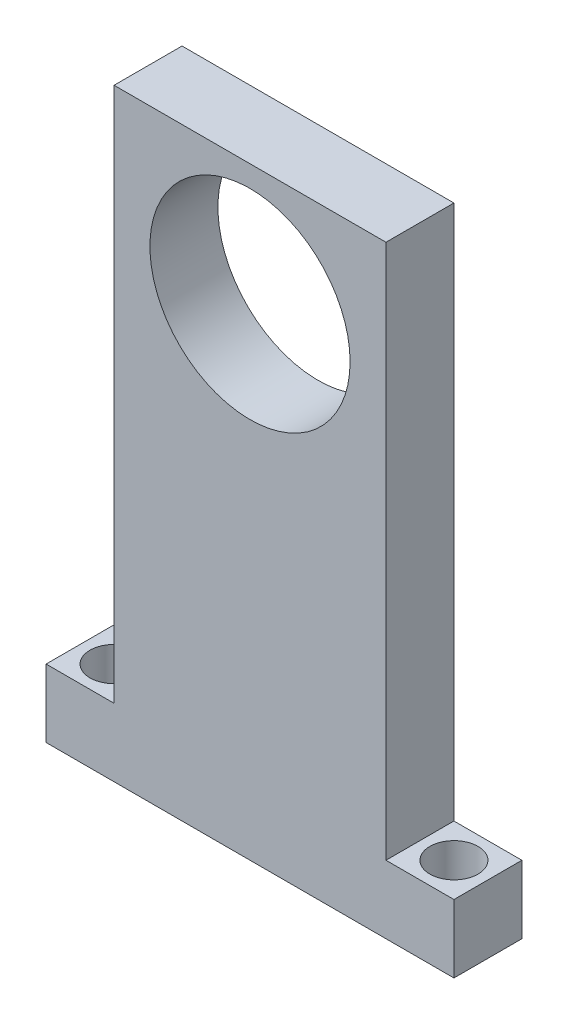
ISO-10303-21;
HEADER;
FILE_DESCRIPTION(('STEP AP214'),'2;1');
FILE_NAME('part.step','',(''),(''),'','','');
FILE_SCHEMA(('AUTOMOTIVE_DESIGN { 1 0 10303 214 1 1 1 1 }'));
ENDSEC;
DATA;
#1=APPLICATION_CONTEXT('core data for automotive mechanical design processes');
#2=APPLICATION_PROTOCOL_DEFINITION('international standard','automotive_design',2000,#1);
#3=PRODUCT_CONTEXT('',#1,'mechanical');
#4=PRODUCT('Part','Part','',(#3));
#5=PRODUCT_RELATED_PRODUCT_CATEGORY('part','',(#4));
#6=PRODUCT_DEFINITION_FORMATION('','',#4);
#7=PRODUCT_DEFINITION_CONTEXT('part definition',#1,'design');
#8=PRODUCT_DEFINITION('design','',#6,#7);
#9=PRODUCT_DEFINITION_SHAPE('','',#8);
#10=(LENGTH_UNIT() NAMED_UNIT(*) SI_UNIT(.MILLI.,.METRE.));
#11=(NAMED_UNIT(*) PLANE_ANGLE_UNIT() SI_UNIT($,.RADIAN.));
#12=(NAMED_UNIT(*) SI_UNIT($,.STERADIAN.) SOLID_ANGLE_UNIT());
#13=UNCERTAINTY_MEASURE_WITH_UNIT(LENGTH_MEASURE(1.E-05),#10,'distance_accuracy_value','');
#14=(GEOMETRIC_REPRESENTATION_CONTEXT(3) GLOBAL_UNCERTAINTY_ASSIGNED_CONTEXT((#13)) GLOBAL_UNIT_ASSIGNED_CONTEXT((#10,
#11,#12)) REPRESENTATION_CONTEXT('',''));
#15=CARTESIAN_POINT('',(0.,0.,0.));
#16=DIRECTION('',(0.,0.,1.));
#17=DIRECTION('',(1.,0.,0.));
#18=AXIS2_PLACEMENT_3D('',#15,#16,#17);
#19=CARTESIAN_POINT('',(0.,6.35,0.));
#20=DIRECTION('',(0.,-1.,0.));
#21=DIRECTION('',(0.,0.,-1.));
#22=AXIS2_PLACEMENT_3D('',#19,#20,#21);
#23=PLANE('',#22);
#24=CARTESIAN_POINT('',(15.875,6.35,0.));
#25=DIRECTION('',(0.,1.,0.));
#26=DIRECTION('',(0.,0.,1.));
#27=AXIS2_PLACEMENT_3D('',#24,#25,#26);
#28=CIRCLE('',#27,2.2479);
#29=CARTESIAN_POINT('',(15.875,6.35,2.2479));
#30=VERTEX_POINT('',#29);
#31=EDGE_CURVE('E191',#30,#30,#28,.T.);
#32=ORIENTED_EDGE('',*,*,#31,.F.);
#33=EDGE_LOOP('',(#32));
#34=FACE_BOUND('',#33,.T.);
#35=DIRECTION('',(0.,0.,-1.));
#36=VECTOR('',#35,1.);
#37=CARTESIAN_POINT('',(12.7,6.35,3.175));
#38=LINE('',#37,#36);
#39=CARTESIAN_POINT('',(12.7,6.35,3.175));
#40=VERTEX_POINT('',#39);
#41=CARTESIAN_POINT('',(12.7,6.35,-3.175));
#42=VERTEX_POINT('',#41);
#43=EDGE_CURVE('E54',#40,#42,#38,.T.);
#44=ORIENTED_EDGE('',*,*,#43,.F.);
#45=DIRECTION('',(1.,0.,0.));
#46=VECTOR('',#45,1.);
#47=CARTESIAN_POINT('',(-19.05,6.35,3.175));
#48=LINE('',#47,#46);
#49=CARTESIAN_POINT('',(19.05,6.35,3.175));
#50=VERTEX_POINT('',#49);
#51=EDGE_CURVE('E143',#40,#50,#48,.T.);
#52=ORIENTED_EDGE('',*,*,#51,.T.);
#53=DIRECTION('',(0.,0.,-1.));
#54=VECTOR('',#53,1.);
#55=CARTESIAN_POINT('',(19.05,6.35,3.175));
#56=LINE('',#55,#54);
#57=CARTESIAN_POINT('',(19.05,6.35,-3.175));
#58=VERTEX_POINT('',#57);
#59=EDGE_CURVE('E134',#50,#58,#56,.T.);
#60=ORIENTED_EDGE('',*,*,#59,.T.);
#61=DIRECTION('',(-1.,0.,0.));
#62=VECTOR('',#61,1.);
#63=CARTESIAN_POINT('',(-19.05,6.35,-3.175));
#64=LINE('',#63,#62);
#65=EDGE_CURVE('E139',#58,#42,#64,.T.);
#66=ORIENTED_EDGE('',*,*,#65,.T.);
#67=EDGE_LOOP('',(#44,#52,#60,#66));
#68=FACE_BOUND('',#67,.T.);
#69=ADVANCED_FACE('F39',(#34,#68),#23,.F.);
#70=CARTESIAN_POINT('',(-15.875,6.35,0.));
#71=DIRECTION('',(0.,1.,0.));
#72=DIRECTION('',(0.,0.,1.));
#73=AXIS2_PLACEMENT_3D('',#70,#71,#72);
#74=CIRCLE('',#73,2.2479);
#75=CARTESIAN_POINT('',(-15.875,6.35,2.2479));
#76=VERTEX_POINT('',#75);
#77=EDGE_CURVE('E194',#76,#76,#74,.T.);
#78=ORIENTED_EDGE('',*,*,#77,.F.);
#79=EDGE_LOOP('',(#78));
#80=FACE_BOUND('',#79,.T.);
#81=DIRECTION('',(0.,0.,1.));
#82=VECTOR('',#81,1.);
#83=CARTESIAN_POINT('',(-12.7,6.35,3.175));
#84=LINE('',#83,#82);
#85=CARTESIAN_POINT('',(-12.7,6.35,-3.175));
#86=VERTEX_POINT('',#85);
#87=CARTESIAN_POINT('',(-12.7,6.35,3.175));
#88=VERTEX_POINT('',#87);
#89=EDGE_CURVE('E62',#86,#88,#84,.T.);
#90=ORIENTED_EDGE('',*,*,#89,.F.);
#91=CARTESIAN_POINT('',(-19.05,6.35,-3.175));
#92=VERTEX_POINT('',#91);
#93=EDGE_CURVE('E137',#86,#92,#64,.T.);
#94=ORIENTED_EDGE('',*,*,#93,.T.);
#95=DIRECTION('',(0.,0.,1.));
#96=VECTOR('',#95,1.);
#97=CARTESIAN_POINT('',(-19.05,6.35,3.175));
#98=LINE('',#97,#96);
#99=CARTESIAN_POINT('',(-19.05,6.35,3.175));
#100=VERTEX_POINT('',#99);
#101=EDGE_CURVE('E141',#92,#100,#98,.T.);
#102=ORIENTED_EDGE('',*,*,#101,.T.);
#103=EDGE_CURVE('E144',#100,#88,#48,.T.);
#104=ORIENTED_EDGE('',*,*,#103,.T.);
#105=EDGE_LOOP('',(#90,#94,#102,#104));
#106=FACE_BOUND('',#105,.T.);
#107=ADVANCED_FACE('F209',(#80,#106),#23,.F.);
#108=CARTESIAN_POINT('',(19.05,6.35,3.175));
#109=DIRECTION('',(-1.,0.,0.));
#110=DIRECTION('',(0.,0.,1.));
#111=AXIS2_PLACEMENT_3D('',#108,#109,#110);
#112=PLANE('',#111);
#113=DIRECTION('',(0.,0.,-1.));
#114=VECTOR('',#113,1.);
#115=CARTESIAN_POINT('',(19.05,0.,3.175));
#116=LINE('',#115,#114);
#117=CARTESIAN_POINT('',(19.05,0.,3.175));
#118=VERTEX_POINT('',#117);
#119=CARTESIAN_POINT('',(19.05,0.,-3.175));
#120=VERTEX_POINT('',#119);
#121=EDGE_CURVE('E125',#118,#120,#116,.T.);
#122=ORIENTED_EDGE('',*,*,#121,.T.);
#123=DIRECTION('',(0.,-1.,0.));
#124=VECTOR('',#123,1.);
#125=CARTESIAN_POINT('',(19.05,6.35,-3.175));
#126=LINE('',#125,#124);
#127=EDGE_CURVE('E11',#58,#120,#126,.T.);
#128=ORIENTED_EDGE('',*,*,#127,.F.);
#129=ORIENTED_EDGE('',*,*,#59,.F.);
#130=DIRECTION('',(0.,-1.,0.));
#131=VECTOR('',#130,1.);
#132=CARTESIAN_POINT('',(19.05,6.35,3.175));
#133=LINE('',#132,#131);
#134=EDGE_CURVE('E145',#50,#118,#133,.T.);
#135=ORIENTED_EDGE('',*,*,#134,.T.);
#136=EDGE_LOOP('',(#122,#128,#129,#135));
#137=FACE_BOUND('',#136,.T.);
#138=ADVANCED_FACE('F41',(#137),#112,.F.);
#139=CARTESIAN_POINT('',(-19.05,6.35,-3.175));
#140=DIRECTION('',(0.,0.,1.));
#141=DIRECTION('',(1.,0.,0.));
#142=AXIS2_PLACEMENT_3D('',#139,#140,#141);
#143=PLANE('',#142);
#144=CARTESIAN_POINT('',(0.,45.,-3.175));
#145=DIRECTION('',(0.,0.,1.));
#146=DIRECTION('',(1.,0.,0.));
#147=AXIS2_PLACEMENT_3D('',#144,#145,#146);
#148=CIRCLE('',#147,9.35);
#149=CARTESIAN_POINT('',(9.35,45.,-3.175));
#150=VERTEX_POINT('',#149);
#151=EDGE_CURVE('E179',#150,#150,#148,.T.);
#152=ORIENTED_EDGE('',*,*,#151,.T.);
#153=EDGE_LOOP('',(#152));
#154=FACE_BOUND('',#153,.T.);
#155=DIRECTION('',(-1.,0.,0.));
#156=VECTOR('',#155,1.);
#157=CARTESIAN_POINT('',(-19.05,0.,-3.175));
#158=LINE('',#157,#156);
#159=CARTESIAN_POINT('',(-19.05,0.,-3.175));
#160=VERTEX_POINT('',#159);
#161=EDGE_CURVE('E128',#120,#160,#158,.T.);
#162=ORIENTED_EDGE('',*,*,#161,.T.);
#163=DIRECTION('',(0.,-1.,0.));
#164=VECTOR('',#163,1.);
#165=CARTESIAN_POINT('',(-19.05,6.35,-3.175));
#166=LINE('',#165,#164);
#167=EDGE_CURVE('E47',#92,#160,#166,.T.);
#168=ORIENTED_EDGE('',*,*,#167,.F.);
#169=ORIENTED_EDGE('',*,*,#93,.F.);
#170=DIRECTION('',(0.,-1.,0.));
#171=VECTOR('',#170,1.);
#172=CARTESIAN_POINT('',(-12.7,56.35,-3.175));
#173=LINE('',#172,#171);
#174=CARTESIAN_POINT('',(-12.7,56.35,-3.175));
#175=VERTEX_POINT('',#174);
#176=EDGE_CURVE('E110',#175,#86,#173,.T.);
#177=ORIENTED_EDGE('',*,*,#176,.F.);
#178=DIRECTION('',(-1.,0.,0.));
#179=VECTOR('',#178,1.);
#180=CARTESIAN_POINT('',(-12.7,56.35,-3.175));
#181=LINE('',#180,#179);
#182=CARTESIAN_POINT('',(12.7,56.35,-3.175));
#183=VERTEX_POINT('',#182);
#184=EDGE_CURVE('E104',#183,#175,#181,.T.);
#185=ORIENTED_EDGE('',*,*,#184,.F.);
#186=DIRECTION('',(0.,-1.,0.));
#187=VECTOR('',#186,1.);
#188=CARTESIAN_POINT('',(12.7,56.35,-3.175));
#189=LINE('',#188,#187);
#190=EDGE_CURVE('E108',#183,#42,#189,.T.);
#191=ORIENTED_EDGE('',*,*,#190,.T.);
#192=ORIENTED_EDGE('',*,*,#65,.F.);
#193=ORIENTED_EDGE('',*,*,#127,.T.);
#194=EDGE_LOOP('',(#162,#168,#169,#177,#185,#191,#192,#193));
#195=FACE_BOUND('',#194,.T.);
#196=ADVANCED_FACE('F106',(#154,#195),#143,.F.);
#197=CARTESIAN_POINT('',(-19.05,6.35,3.175));
#198=DIRECTION('',(1.,0.,0.));
#199=DIRECTION('',(0.,0.,-1.));
#200=AXIS2_PLACEMENT_3D('',#197,#198,#199);
#201=PLANE('',#200);
#202=DIRECTION('',(0.,0.,1.));
#203=VECTOR('',#202,1.);
#204=CARTESIAN_POINT('',(-19.05,0.,3.175));
#205=LINE('',#204,#203);
#206=CARTESIAN_POINT('',(-19.05,0.,3.175));
#207=VERTEX_POINT('',#206);
#208=EDGE_CURVE('E148',#160,#207,#205,.T.);
#209=ORIENTED_EDGE('',*,*,#208,.T.);
#210=DIRECTION('',(0.,-1.,0.));
#211=VECTOR('',#210,1.);
#212=CARTESIAN_POINT('',(-19.05,6.35,3.175));
#213=LINE('',#212,#211);
#214=EDGE_CURVE('E153',#100,#207,#213,.T.);
#215=ORIENTED_EDGE('',*,*,#214,.F.);
#216=ORIENTED_EDGE('',*,*,#101,.F.);
#217=ORIENTED_EDGE('',*,*,#167,.T.);
#218=EDGE_LOOP('',(#209,#215,#216,#217));
#219=FACE_BOUND('',#218,.T.);
#220=ADVANCED_FACE('F160',(#219),#201,.F.);
#221=CARTESIAN_POINT('',(-19.05,6.35,3.175));
#222=DIRECTION('',(0.,0.,-1.));
#223=DIRECTION('',(-1.,0.,0.));
#224=AXIS2_PLACEMENT_3D('',#221,#222,#223);
#225=PLANE('',#224);
#226=CARTESIAN_POINT('',(0.,45.,3.175));
#227=DIRECTION('',(0.,0.,1.));
#228=DIRECTION('',(1.,0.,0.));
#229=AXIS2_PLACEMENT_3D('',#226,#227,#228);
#230=CIRCLE('',#229,9.35);
#231=CARTESIAN_POINT('',(9.35,45.,3.175));
#232=VERTEX_POINT('',#231);
#233=EDGE_CURVE('E182',#232,#232,#230,.T.);
#234=ORIENTED_EDGE('',*,*,#233,.F.);
#235=EDGE_LOOP('',(#234));
#236=FACE_BOUND('',#235,.T.);
#237=DIRECTION('',(1.,0.,0.));
#238=VECTOR('',#237,1.);
#239=CARTESIAN_POINT('',(-19.05,0.,3.175));
#240=LINE('',#239,#238);
#241=EDGE_CURVE('E138',#207,#118,#240,.T.);
#242=ORIENTED_EDGE('',*,*,#241,.T.);
#243=ORIENTED_EDGE('',*,*,#134,.F.);
#244=ORIENTED_EDGE('',*,*,#51,.F.);
#245=DIRECTION('',(0.,-1.,0.));
#246=VECTOR('',#245,1.);
#247=CARTESIAN_POINT('',(12.7,56.35,3.175));
#248=LINE('',#247,#246);
#249=CARTESIAN_POINT('',(12.7,56.35,3.175));
#250=VERTEX_POINT('',#249);
#251=EDGE_CURVE('E173',#250,#40,#248,.T.);
#252=ORIENTED_EDGE('',*,*,#251,.F.);
#253=DIRECTION('',(1.,0.,0.));
#254=VECTOR('',#253,1.);
#255=CARTESIAN_POINT('',(-12.7,56.35,3.175));
#256=LINE('',#255,#254);
#257=CARTESIAN_POINT('',(-12.7,56.35,3.175));
#258=VERTEX_POINT('',#257);
#259=EDGE_CURVE('E119',#258,#250,#256,.T.);
#260=ORIENTED_EDGE('',*,*,#259,.F.);
#261=DIRECTION('',(0.,-1.,0.));
#262=VECTOR('',#261,1.);
#263=CARTESIAN_POINT('',(-12.7,56.35,3.175));
#264=LINE('',#263,#262);
#265=EDGE_CURVE('E130',#258,#88,#264,.T.);
#266=ORIENTED_EDGE('',*,*,#265,.T.);
#267=ORIENTED_EDGE('',*,*,#103,.F.);
#268=ORIENTED_EDGE('',*,*,#214,.T.);
#269=EDGE_LOOP('',(#242,#243,#244,#252,#260,#266,#267,#268));
#270=FACE_BOUND('',#269,.T.);
#271=ADVANCED_FACE('F168',(#236,#270),#225,.F.);
#272=CARTESIAN_POINT('',(0.,0.,0.));
#273=DIRECTION('',(0.,-1.,0.));
#274=DIRECTION('',(0.,0.,-1.));
#275=AXIS2_PLACEMENT_3D('',#272,#273,#274);
#276=PLANE('',#275);
#277=CARTESIAN_POINT('',(-15.875,0.,0.));
#278=DIRECTION('',(0.,1.,0.));
#279=DIRECTION('',(0.,0.,1.));
#280=AXIS2_PLACEMENT_3D('',#277,#278,#279);
#281=CIRCLE('',#280,2.2479);
#282=CARTESIAN_POINT('',(-15.875,0.,2.2479));
#283=VERTEX_POINT('',#282);
#284=EDGE_CURVE('E185',#283,#283,#281,.T.);
#285=ORIENTED_EDGE('',*,*,#284,.T.);
#286=EDGE_LOOP('',(#285));
#287=FACE_BOUND('',#286,.T.);
#288=CARTESIAN_POINT('',(15.875,0.,0.));
#289=DIRECTION('',(0.,1.,0.));
#290=DIRECTION('',(0.,0.,1.));
#291=AXIS2_PLACEMENT_3D('',#288,#289,#290);
#292=CIRCLE('',#291,2.2479);
#293=CARTESIAN_POINT('',(15.875,0.,2.2479));
#294=VERTEX_POINT('',#293);
#295=EDGE_CURVE('E188',#294,#294,#292,.T.);
#296=ORIENTED_EDGE('',*,*,#295,.T.);
#297=EDGE_LOOP('',(#296));
#298=FACE_BOUND('',#297,.T.);
#299=ORIENTED_EDGE('',*,*,#121,.F.);
#300=ORIENTED_EDGE('',*,*,#241,.F.);
#301=ORIENTED_EDGE('',*,*,#208,.F.);
#302=ORIENTED_EDGE('',*,*,#161,.F.);
#303=EDGE_LOOP('',(#299,#300,#301,#302));
#304=FACE_BOUND('',#303,.T.);
#305=ADVANCED_FACE('F165',(#287,#298,#304),#276,.T.);
#306=CARTESIAN_POINT('',(12.7,56.35,3.175));
#307=DIRECTION('',(-1.,0.,0.));
#308=DIRECTION('',(0.,0.,1.));
#309=AXIS2_PLACEMENT_3D('',#306,#307,#308);
#310=PLANE('',#309);
#311=ORIENTED_EDGE('',*,*,#43,.T.);
#312=ORIENTED_EDGE('',*,*,#190,.F.);
#313=DIRECTION('',(0.,0.,-1.));
#314=VECTOR('',#313,1.);
#315=CARTESIAN_POINT('',(12.7,56.35,3.175));
#316=LINE('',#315,#314);
#317=EDGE_CURVE('E114',#250,#183,#316,.T.);
#318=ORIENTED_EDGE('',*,*,#317,.F.);
#319=ORIENTED_EDGE('',*,*,#251,.T.);
#320=EDGE_LOOP('',(#311,#312,#318,#319));
#321=FACE_BOUND('',#320,.T.);
#322=ADVANCED_FACE('F124',(#321),#310,.F.);
#323=CARTESIAN_POINT('',(-12.7,56.35,3.175));
#324=DIRECTION('',(1.,0.,0.));
#325=DIRECTION('',(0.,0.,-1.));
#326=AXIS2_PLACEMENT_3D('',#323,#324,#325);
#327=PLANE('',#326);
#328=ORIENTED_EDGE('',*,*,#89,.T.);
#329=ORIENTED_EDGE('',*,*,#265,.F.);
#330=DIRECTION('',(0.,0.,1.));
#331=VECTOR('',#330,1.);
#332=CARTESIAN_POINT('',(-12.7,56.35,3.175));
#333=LINE('',#332,#331);
#334=EDGE_CURVE('E113',#175,#258,#333,.T.);
#335=ORIENTED_EDGE('',*,*,#334,.F.);
#336=ORIENTED_EDGE('',*,*,#176,.T.);
#337=EDGE_LOOP('',(#328,#329,#335,#336));
#338=FACE_BOUND('',#337,.T.);
#339=ADVANCED_FACE('F243',(#338),#327,.F.);
#340=CARTESIAN_POINT('',(0.,56.35,0.));
#341=DIRECTION('',(0.,-1.,0.));
#342=DIRECTION('',(0.,0.,-1.));
#343=AXIS2_PLACEMENT_3D('',#340,#341,#342);
#344=PLANE('',#343);
#345=ORIENTED_EDGE('',*,*,#317,.T.);
#346=ORIENTED_EDGE('',*,*,#184,.T.);
#347=ORIENTED_EDGE('',*,*,#334,.T.);
#348=ORIENTED_EDGE('',*,*,#259,.T.);
#349=EDGE_LOOP('',(#345,#346,#347,#348));
#350=FACE_BOUND('',#349,.T.);
#351=ADVANCED_FACE('F117',(#350),#344,.F.);
#352=CARTESIAN_POINT('',(0.,45.,-3.175));
#353=DIRECTION('',(0.,0.,1.));
#354=DIRECTION('',(1.,0.,0.));
#355=AXIS2_PLACEMENT_3D('',#352,#353,#354);
#356=CYLINDRICAL_SURFACE('',#355,9.35);
#357=ORIENTED_EDGE('',*,*,#151,.F.);
#358=EDGE_LOOP('',(#357));
#359=FACE_BOUND('',#358,.T.);
#360=ORIENTED_EDGE('',*,*,#233,.T.);
#361=EDGE_LOOP('',(#360));
#362=FACE_BOUND('',#361,.T.);
#363=ADVANCED_FACE('F233',(#359,#362),#356,.F.);
#364=CARTESIAN_POINT('',(15.875,0.,0.));
#365=DIRECTION('',(0.,1.,0.));
#366=DIRECTION('',(0.,0.,1.));
#367=AXIS2_PLACEMENT_3D('',#364,#365,#366);
#368=CYLINDRICAL_SURFACE('',#367,2.2479);
#369=ORIENTED_EDGE('',*,*,#295,.F.);
#370=EDGE_LOOP('',(#369));
#371=FACE_BOUND('',#370,.T.);
#372=ORIENTED_EDGE('',*,*,#31,.T.);
#373=EDGE_LOOP('',(#372));
#374=FACE_BOUND('',#373,.T.);
#375=ADVANCED_FACE('F205',(#371,#374),#368,.F.);
#376=CARTESIAN_POINT('',(-15.875,0.,0.));
#377=DIRECTION('',(0.,1.,0.));
#378=DIRECTION('',(0.,0.,1.));
#379=AXIS2_PLACEMENT_3D('',#376,#377,#378);
#380=CYLINDRICAL_SURFACE('',#379,2.2479);
#381=ORIENTED_EDGE('',*,*,#284,.F.);
#382=EDGE_LOOP('',(#381));
#383=FACE_BOUND('',#382,.T.);
#384=ORIENTED_EDGE('',*,*,#77,.T.);
#385=EDGE_LOOP('',(#384));
#386=FACE_BOUND('',#385,.T.);
#387=ADVANCED_FACE('F202',(#383,#386),#380,.F.);
#388=CLOSED_SHELL('',(#69,#107,#138,#196,#220,#271,#305,#322,#339,#351,#363,#375,#387));
#389=MANIFOLD_SOLID_BREP('B2',#388);
#390=ADVANCED_BREP_SHAPE_REPRESENTATION('',(#18,#389),#14);
#391=SHAPE_DEFINITION_REPRESENTATION(#9,#390);
ENDSEC;
END-ISO-10303-21;
